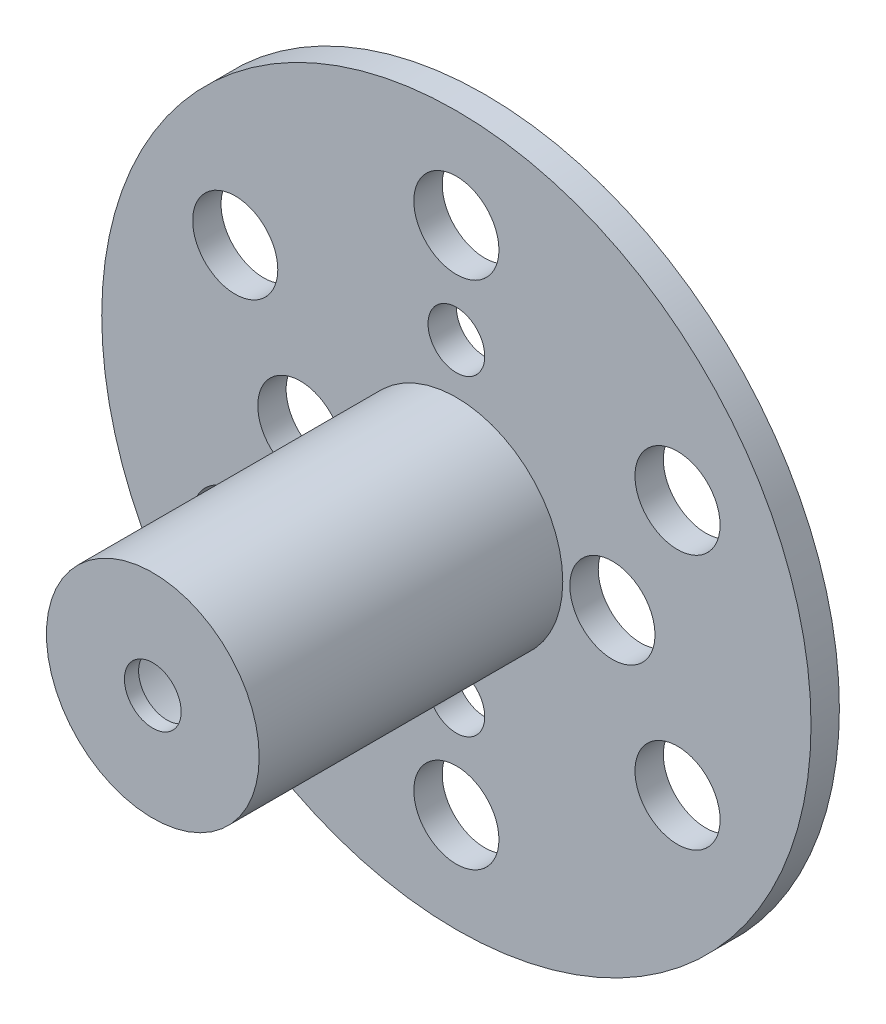
ISO-10303-21;
HEADER;
FILE_DESCRIPTION(('STEP AP214'),'2;1');
FILE_NAME('part.step','',(''),(''),'','','');
FILE_SCHEMA(('AUTOMOTIVE_DESIGN { 1 0 10303 214 1 1 1 1 }'));
ENDSEC;
DATA;
#1=APPLICATION_CONTEXT('core data for automotive mechanical design processes');
#2=APPLICATION_PROTOCOL_DEFINITION('international standard','automotive_design',2000,#1);
#3=PRODUCT_CONTEXT('',#1,'mechanical');
#4=PRODUCT('Part','Part','',(#3));
#5=PRODUCT_RELATED_PRODUCT_CATEGORY('part','',(#4));
#6=PRODUCT_DEFINITION_FORMATION('','',#4);
#7=PRODUCT_DEFINITION_CONTEXT('part definition',#1,'design');
#8=PRODUCT_DEFINITION('design','',#6,#7);
#9=PRODUCT_DEFINITION_SHAPE('','',#8);
#10=(LENGTH_UNIT() NAMED_UNIT(*) SI_UNIT(.MILLI.,.METRE.));
#11=(NAMED_UNIT(*) PLANE_ANGLE_UNIT() SI_UNIT($,.RADIAN.));
#12=(NAMED_UNIT(*) SI_UNIT($,.STERADIAN.) SOLID_ANGLE_UNIT());
#13=UNCERTAINTY_MEASURE_WITH_UNIT(LENGTH_MEASURE(1.E-05),#10,'distance_accuracy_value','');
#14=(GEOMETRIC_REPRESENTATION_CONTEXT(3) GLOBAL_UNCERTAINTY_ASSIGNED_CONTEXT((#13)) GLOBAL_UNIT_ASSIGNED_CONTEXT((#10,
#11,#12)) REPRESENTATION_CONTEXT('',''));
#15=CARTESIAN_POINT('',(0.,0.,0.));
#16=DIRECTION('',(0.,0.,1.));
#17=DIRECTION('',(1.,0.,0.));
#18=AXIS2_PLACEMENT_3D('',#15,#16,#17);
#19=CARTESIAN_POINT('',(0.,0.,1.));
#20=DIRECTION('',(0.,0.,1.));
#21=DIRECTION('',(1.,0.,0.));
#22=AXIS2_PLACEMENT_3D('',#19,#20,#21);
#23=PLANE('',#22);
#24=CARTESIAN_POINT('',(0.,-5.5,1.));
#25=DIRECTION('',(0.,0.,1.));
#26=DIRECTION('',(-1.,0.,0.));
#27=AXIS2_PLACEMENT_3D('',#24,#25,#26);
#28=CIRCLE('',#27,1.);
#29=CARTESIAN_POINT('',(-1.,-5.5,1.));
#30=VERTEX_POINT('',#29);
#31=EDGE_CURVE('E100',#30,#30,#28,.T.);
#32=ORIENTED_EDGE('',*,*,#31,.F.);
#33=EDGE_LOOP('',(#32));
#34=FACE_BOUND('',#33,.T.);
#35=CARTESIAN_POINT('',(5.5,0.,1.));
#36=DIRECTION('',(0.,0.,1.));
#37=DIRECTION('',(-1.,0.,0.));
#38=AXIS2_PLACEMENT_3D('',#35,#36,#37);
#39=CIRCLE('',#38,1.5);
#40=CARTESIAN_POINT('',(4.,0.,1.));
#41=VERTEX_POINT('',#40);
#42=EDGE_CURVE('E88',#41,#41,#39,.T.);
#43=ORIENTED_EDGE('',*,*,#42,.F.);
#44=EDGE_LOOP('',(#43));
#45=FACE_BOUND('',#44,.T.);
#46=CARTESIAN_POINT('',(-7.79422863405995,4.49999999999999,1.));
#47=DIRECTION('',(0.,0.,1.));
#48=DIRECTION('',(1.,0.,0.));
#49=AXIS2_PLACEMENT_3D('',#46,#47,#48);
#50=CIRCLE('',#49,1.5);
#51=CARTESIAN_POINT('',(-6.29422863405995,4.49999999999999,1.));
#52=VERTEX_POINT('',#51);
#53=EDGE_CURVE('E76',#52,#52,#50,.T.);
#54=ORIENTED_EDGE('',*,*,#53,.F.);
#55=EDGE_LOOP('',(#54));
#56=FACE_BOUND('',#55,.T.);
#57=CARTESIAN_POINT('',(0.,-9.,1.));
#58=DIRECTION('',(0.,0.,1.));
#59=DIRECTION('',(1.,0.,0.));
#60=AXIS2_PLACEMENT_3D('',#57,#58,#59);
#61=CIRCLE('',#60,1.5);
#62=CARTESIAN_POINT('',(1.5,-9.,1.));
#63=VERTEX_POINT('',#62);
#64=EDGE_CURVE('E64',#63,#63,#61,.T.);
#65=ORIENTED_EDGE('',*,*,#64,.F.);
#66=EDGE_LOOP('',(#65));
#67=FACE_BOUND('',#66,.T.);
#68=CARTESIAN_POINT('',(7.79422863405995,4.5,1.));
#69=DIRECTION('',(0.,0.,1.));
#70=DIRECTION('',(1.,0.,0.));
#71=AXIS2_PLACEMENT_3D('',#68,#69,#70);
#72=CIRCLE('',#71,1.5);
#73=CARTESIAN_POINT('',(9.29422863405994,4.5,1.));
#74=VERTEX_POINT('',#73);
#75=EDGE_CURVE('E52',#74,#74,#72,.T.);
#76=ORIENTED_EDGE('',*,*,#75,.F.);
#77=EDGE_LOOP('',(#76));
#78=FACE_BOUND('',#77,.T.);
#79=CARTESIAN_POINT('',(0.,0.,1.));
#80=DIRECTION('',(0.,0.,1.));
#81=DIRECTION('',(1.,0.,0.));
#82=AXIS2_PLACEMENT_3D('',#79,#80,#81);
#83=CIRCLE('',#82,12.5);
#84=CARTESIAN_POINT('',(12.5,0.,1.));
#85=VERTEX_POINT('',#84);
#86=EDGE_CURVE('E10',#85,#85,#83,.T.);
#87=ORIENTED_EDGE('',*,*,#86,.T.);
#88=EDGE_LOOP('',(#87));
#89=FACE_BOUND('',#88,.T.);
#90=CARTESIAN_POINT('',(0.,9.,1.));
#91=DIRECTION('',(0.,0.,1.));
#92=DIRECTION('',(1.,0.,0.));
#93=AXIS2_PLACEMENT_3D('',#90,#91,#92);
#94=CIRCLE('',#93,1.5);
#95=CARTESIAN_POINT('',(1.5,9.,1.));
#96=VERTEX_POINT('',#95);
#97=EDGE_CURVE('E48',#96,#96,#94,.T.);
#98=ORIENTED_EDGE('',*,*,#97,.F.);
#99=EDGE_LOOP('',(#98));
#100=FACE_BOUND('',#99,.T.);
#101=CARTESIAN_POINT('',(7.79422863405995,-4.5,1.));
#102=DIRECTION('',(0.,0.,1.));
#103=DIRECTION('',(1.,0.,0.));
#104=AXIS2_PLACEMENT_3D('',#101,#102,#103);
#105=CIRCLE('',#104,1.5);
#106=CARTESIAN_POINT('',(9.29422863405995,-4.5,1.));
#107=VERTEX_POINT('',#106);
#108=EDGE_CURVE('E58',#107,#107,#105,.T.);
#109=ORIENTED_EDGE('',*,*,#108,.F.);
#110=EDGE_LOOP('',(#109));
#111=FACE_BOUND('',#110,.T.);
#112=CARTESIAN_POINT('',(-7.79422863405995,-4.5,1.));
#113=DIRECTION('',(0.,0.,1.));
#114=DIRECTION('',(1.,0.,0.));
#115=AXIS2_PLACEMENT_3D('',#112,#113,#114);
#116=CIRCLE('',#115,1.5);
#117=CARTESIAN_POINT('',(-6.29422863405995,-4.5,1.));
#118=VERTEX_POINT('',#117);
#119=EDGE_CURVE('E70',#118,#118,#116,.T.);
#120=ORIENTED_EDGE('',*,*,#119,.F.);
#121=EDGE_LOOP('',(#120));
#122=FACE_BOUND('',#121,.T.);
#123=CARTESIAN_POINT('',(-5.5,0.,1.));
#124=DIRECTION('',(0.,0.,1.));
#125=DIRECTION('',(1.,0.,0.));
#126=AXIS2_PLACEMENT_3D('',#123,#124,#125);
#127=CIRCLE('',#126,1.5);
#128=CARTESIAN_POINT('',(-4.,0.,1.));
#129=VERTEX_POINT('',#128);
#130=EDGE_CURVE('E82',#129,#129,#127,.T.);
#131=ORIENTED_EDGE('',*,*,#130,.F.);
#132=EDGE_LOOP('',(#131));
#133=FACE_BOUND('',#132,.T.);
#134=CARTESIAN_POINT('',(0.,5.5,1.));
#135=DIRECTION('',(0.,0.,1.));
#136=DIRECTION('',(1.,0.,0.));
#137=AXIS2_PLACEMENT_3D('',#134,#135,#136);
#138=CIRCLE('',#137,1.);
#139=CARTESIAN_POINT('',(1.,5.5,1.));
#140=VERTEX_POINT('',#139);
#141=EDGE_CURVE('E94',#140,#140,#138,.T.);
#142=ORIENTED_EDGE('',*,*,#141,.F.);
#143=EDGE_LOOP('',(#142));
#144=FACE_BOUND('',#143,.T.);
#145=CARTESIAN_POINT('',(0.,0.,1.));
#146=DIRECTION('',(0.,0.,1.));
#147=DIRECTION('',(1.,0.,0.));
#148=AXIS2_PLACEMENT_3D('',#145,#146,#147);
#149=CIRCLE('',#148,3.75);
#150=CARTESIAN_POINT('',(3.75,0.,1.));
#151=VERTEX_POINT('',#150);
#152=EDGE_CURVE('E106',#151,#151,#149,.T.);
#153=ORIENTED_EDGE('',*,*,#152,.F.);
#154=EDGE_LOOP('',(#153));
#155=FACE_BOUND('',#154,.T.);
#156=ADVANCED_FACE('F33',(#34,#45,#56,#67,#78,#89,#100,#111,#122,#133,#144,#155),#23,.T.);
#157=CARTESIAN_POINT('',(0.,0.,0.));
#158=DIRECTION('',(0.,0.,1.));
#159=DIRECTION('',(1.,0.,0.));
#160=AXIS2_PLACEMENT_3D('',#157,#158,#159);
#161=PLANE('',#160);
#162=CARTESIAN_POINT('',(0.,0.,0.));
#163=DIRECTION('',(0.,0.,1.));
#164=DIRECTION('',(1.,0.,0.));
#165=AXIS2_PLACEMENT_3D('',#162,#163,#164);
#166=CIRCLE('',#165,12.5);
#167=CARTESIAN_POINT('',(12.5,0.,0.));
#168=VERTEX_POINT('',#167);
#169=EDGE_CURVE('E37',#168,#168,#166,.T.);
#170=ORIENTED_EDGE('',*,*,#169,.F.);
#171=EDGE_LOOP('',(#170));
#172=FACE_BOUND('',#171,.T.);
#173=CARTESIAN_POINT('',(0.,0.,0.));
#174=DIRECTION('',(0.,0.,1.));
#175=DIRECTION('',(1.,0.,0.));
#176=AXIS2_PLACEMENT_3D('',#173,#174,#175);
#177=CIRCLE('',#176,2.75);
#178=CARTESIAN_POINT('',(2.75,0.,0.));
#179=VERTEX_POINT('',#178);
#180=EDGE_CURVE('E44',#179,#179,#177,.T.);
#181=ORIENTED_EDGE('',*,*,#180,.T.);
#182=EDGE_LOOP('',(#181));
#183=FACE_BOUND('',#182,.T.);
#184=CARTESIAN_POINT('',(0.,9.,0.));
#185=DIRECTION('',(0.,0.,1.));
#186=DIRECTION('',(1.,0.,0.));
#187=AXIS2_PLACEMENT_3D('',#184,#185,#186);
#188=CIRCLE('',#187,1.5);
#189=CARTESIAN_POINT('',(1.5,9.,0.));
#190=VERTEX_POINT('',#189);
#191=EDGE_CURVE('E49',#190,#190,#188,.T.);
#192=ORIENTED_EDGE('',*,*,#191,.T.);
#193=EDGE_LOOP('',(#192));
#194=FACE_BOUND('',#193,.T.);
#195=CARTESIAN_POINT('',(7.79422863405995,4.5,0.));
#196=DIRECTION('',(0.,0.,1.));
#197=DIRECTION('',(1.,0.,0.));
#198=AXIS2_PLACEMENT_3D('',#195,#196,#197);
#199=CIRCLE('',#198,1.5);
#200=CARTESIAN_POINT('',(9.29422863405994,4.5,0.));
#201=VERTEX_POINT('',#200);
#202=EDGE_CURVE('E55',#201,#201,#199,.T.);
#203=ORIENTED_EDGE('',*,*,#202,.T.);
#204=EDGE_LOOP('',(#203));
#205=FACE_BOUND('',#204,.T.);
#206=CARTESIAN_POINT('',(7.79422863405995,-4.5,0.));
#207=DIRECTION('',(0.,0.,1.));
#208=DIRECTION('',(1.,0.,0.));
#209=AXIS2_PLACEMENT_3D('',#206,#207,#208);
#210=CIRCLE('',#209,1.5);
#211=CARTESIAN_POINT('',(9.29422863405995,-4.5,0.));
#212=VERTEX_POINT('',#211);
#213=EDGE_CURVE('E61',#212,#212,#210,.T.);
#214=ORIENTED_EDGE('',*,*,#213,.T.);
#215=EDGE_LOOP('',(#214));
#216=FACE_BOUND('',#215,.T.);
#217=CARTESIAN_POINT('',(0.,-9.,0.));
#218=DIRECTION('',(0.,0.,1.));
#219=DIRECTION('',(1.,0.,0.));
#220=AXIS2_PLACEMENT_3D('',#217,#218,#219);
#221=CIRCLE('',#220,1.5);
#222=CARTESIAN_POINT('',(1.5,-9.,0.));
#223=VERTEX_POINT('',#222);
#224=EDGE_CURVE('E67',#223,#223,#221,.T.);
#225=ORIENTED_EDGE('',*,*,#224,.T.);
#226=EDGE_LOOP('',(#225));
#227=FACE_BOUND('',#226,.T.);
#228=CARTESIAN_POINT('',(-7.79422863405995,-4.5,0.));
#229=DIRECTION('',(0.,0.,1.));
#230=DIRECTION('',(1.,0.,0.));
#231=AXIS2_PLACEMENT_3D('',#228,#229,#230);
#232=CIRCLE('',#231,1.5);
#233=CARTESIAN_POINT('',(-6.29422863405995,-4.5,0.));
#234=VERTEX_POINT('',#233);
#235=EDGE_CURVE('E73',#234,#234,#232,.T.);
#236=ORIENTED_EDGE('',*,*,#235,.T.);
#237=EDGE_LOOP('',(#236));
#238=FACE_BOUND('',#237,.T.);
#239=CARTESIAN_POINT('',(-7.79422863405995,4.49999999999999,0.));
#240=DIRECTION('',(0.,0.,1.));
#241=DIRECTION('',(1.,0.,0.));
#242=AXIS2_PLACEMENT_3D('',#239,#240,#241);
#243=CIRCLE('',#242,1.5);
#244=CARTESIAN_POINT('',(-6.29422863405995,4.49999999999999,0.));
#245=VERTEX_POINT('',#244);
#246=EDGE_CURVE('E79',#245,#245,#243,.T.);
#247=ORIENTED_EDGE('',*,*,#246,.T.);
#248=EDGE_LOOP('',(#247));
#249=FACE_BOUND('',#248,.T.);
#250=CARTESIAN_POINT('',(-5.5,0.,0.));
#251=DIRECTION('',(0.,0.,1.));
#252=DIRECTION('',(1.,0.,0.));
#253=AXIS2_PLACEMENT_3D('',#250,#251,#252);
#254=CIRCLE('',#253,1.5);
#255=CARTESIAN_POINT('',(-4.,0.,0.));
#256=VERTEX_POINT('',#255);
#257=EDGE_CURVE('E85',#256,#256,#254,.T.);
#258=ORIENTED_EDGE('',*,*,#257,.T.);
#259=EDGE_LOOP('',(#258));
#260=FACE_BOUND('',#259,.T.);
#261=CARTESIAN_POINT('',(5.5,0.,0.));
#262=DIRECTION('',(0.,0.,1.));
#263=DIRECTION('',(-1.,0.,0.));
#264=AXIS2_PLACEMENT_3D('',#261,#262,#263);
#265=CIRCLE('',#264,1.5);
#266=CARTESIAN_POINT('',(4.,0.,0.));
#267=VERTEX_POINT('',#266);
#268=EDGE_CURVE('E91',#267,#267,#265,.T.);
#269=ORIENTED_EDGE('',*,*,#268,.T.);
#270=EDGE_LOOP('',(#269));
#271=FACE_BOUND('',#270,.T.);
#272=CARTESIAN_POINT('',(0.,5.5,0.));
#273=DIRECTION('',(0.,0.,1.));
#274=DIRECTION('',(1.,0.,0.));
#275=AXIS2_PLACEMENT_3D('',#272,#273,#274);
#276=CIRCLE('',#275,1.);
#277=CARTESIAN_POINT('',(1.,5.5,0.));
#278=VERTEX_POINT('',#277);
#279=EDGE_CURVE('E97',#278,#278,#276,.T.);
#280=ORIENTED_EDGE('',*,*,#279,.T.);
#281=EDGE_LOOP('',(#280));
#282=FACE_BOUND('',#281,.T.);
#283=CARTESIAN_POINT('',(0.,-5.5,0.));
#284=DIRECTION('',(0.,0.,1.));
#285=DIRECTION('',(-1.,0.,0.));
#286=AXIS2_PLACEMENT_3D('',#283,#284,#285);
#287=CIRCLE('',#286,1.);
#288=CARTESIAN_POINT('',(-1.,-5.5,0.));
#289=VERTEX_POINT('',#288);
#290=EDGE_CURVE('E103',#289,#289,#287,.T.);
#291=ORIENTED_EDGE('',*,*,#290,.T.);
#292=EDGE_LOOP('',(#291));
#293=FACE_BOUND('',#292,.T.);
#294=ADVANCED_FACE('F141',(#172,#183,#194,#205,#216,#227,#238,#249,#260,#271,#282,#293),#161,.F.);
#295=CARTESIAN_POINT('',(0.,0.,1.));
#296=DIRECTION('',(0.,0.,-1.));
#297=DIRECTION('',(-1.,0.,0.));
#298=AXIS2_PLACEMENT_3D('',#295,#296,#297);
#299=CYLINDRICAL_SURFACE('',#298,12.5);
#300=ORIENTED_EDGE('',*,*,#86,.F.);
#301=EDGE_LOOP('',(#300));
#302=FACE_BOUND('',#301,.T.);
#303=ORIENTED_EDGE('',*,*,#169,.T.);
#304=EDGE_LOOP('',(#303));
#305=FACE_BOUND('',#304,.T.);
#306=ADVANCED_FACE('F35',(#302,#305),#299,.T.);
#307=CARTESIAN_POINT('',(0.,0.,1.));
#308=DIRECTION('',(0.,0.,-1.));
#309=DIRECTION('',(-1.,0.,0.));
#310=AXIS2_PLACEMENT_3D('',#307,#308,#309);
#311=CYLINDRICAL_SURFACE('',#310,2.75);
#312=ORIENTED_EDGE('',*,*,#180,.F.);
#313=EDGE_LOOP('',(#312));
#314=FACE_BOUND('',#313,.T.);
#315=CARTESIAN_POINT('',(0.,0.,11.2));
#316=DIRECTION('',(0.,0.,1.));
#317=DIRECTION('',(1.,0.,0.));
#318=AXIS2_PLACEMENT_3D('',#315,#316,#317);
#319=CIRCLE('',#318,2.75);
#320=CARTESIAN_POINT('',(2.75,0.,11.2));
#321=VERTEX_POINT('',#320);
#322=EDGE_CURVE('E111',#321,#321,#319,.T.);
#323=ORIENTED_EDGE('',*,*,#322,.T.);
#324=EDGE_LOOP('',(#323));
#325=FACE_BOUND('',#324,.T.);
#326=ADVANCED_FACE('F151',(#314,#325),#311,.F.);
#327=CARTESIAN_POINT('',(0.,9.,1.));
#328=DIRECTION('',(0.,0.,-1.));
#329=DIRECTION('',(-1.,0.,0.));
#330=AXIS2_PLACEMENT_3D('',#327,#328,#329);
#331=CYLINDRICAL_SURFACE('',#330,1.5);
#332=ORIENTED_EDGE('',*,*,#97,.T.);
#333=EDGE_LOOP('',(#332));
#334=FACE_BOUND('',#333,.T.);
#335=ORIENTED_EDGE('',*,*,#191,.F.);
#336=EDGE_LOOP('',(#335));
#337=FACE_BOUND('',#336,.T.);
#338=ADVANCED_FACE('F154',(#334,#337),#331,.F.);
#339=CARTESIAN_POINT('',(7.79422863405995,4.5,1.));
#340=DIRECTION('',(0.,0.,-1.));
#341=DIRECTION('',(-1.,0.,0.));
#342=AXIS2_PLACEMENT_3D('',#339,#340,#341);
#343=CYLINDRICAL_SURFACE('',#342,1.5);
#344=ORIENTED_EDGE('',*,*,#75,.T.);
#345=EDGE_LOOP('',(#344));
#346=FACE_BOUND('',#345,.T.);
#347=ORIENTED_EDGE('',*,*,#202,.F.);
#348=EDGE_LOOP('',(#347));
#349=FACE_BOUND('',#348,.T.);
#350=ADVANCED_FACE('F158',(#346,#349),#343,.F.);
#351=CARTESIAN_POINT('',(7.79422863405995,-4.5,1.));
#352=DIRECTION('',(0.,0.,-1.));
#353=DIRECTION('',(-1.,0.,0.));
#354=AXIS2_PLACEMENT_3D('',#351,#352,#353);
#355=CYLINDRICAL_SURFACE('',#354,1.5);
#356=ORIENTED_EDGE('',*,*,#108,.T.);
#357=EDGE_LOOP('',(#356));
#358=FACE_BOUND('',#357,.T.);
#359=ORIENTED_EDGE('',*,*,#213,.F.);
#360=EDGE_LOOP('',(#359));
#361=FACE_BOUND('',#360,.T.);
#362=ADVANCED_FACE('F162',(#358,#361),#355,.F.);
#363=CARTESIAN_POINT('',(0.,-9.,1.));
#364=DIRECTION('',(0.,0.,-1.));
#365=DIRECTION('',(-1.,0.,0.));
#366=AXIS2_PLACEMENT_3D('',#363,#364,#365);
#367=CYLINDRICAL_SURFACE('',#366,1.5);
#368=ORIENTED_EDGE('',*,*,#64,.T.);
#369=EDGE_LOOP('',(#368));
#370=FACE_BOUND('',#369,.T.);
#371=ORIENTED_EDGE('',*,*,#224,.F.);
#372=EDGE_LOOP('',(#371));
#373=FACE_BOUND('',#372,.T.);
#374=ADVANCED_FACE('F166',(#370,#373),#367,.F.);
#375=CARTESIAN_POINT('',(-7.79422863405995,-4.5,1.));
#376=DIRECTION('',(0.,0.,-1.));
#377=DIRECTION('',(-1.,0.,0.));
#378=AXIS2_PLACEMENT_3D('',#375,#376,#377);
#379=CYLINDRICAL_SURFACE('',#378,1.5);
#380=ORIENTED_EDGE('',*,*,#119,.T.);
#381=EDGE_LOOP('',(#380));
#382=FACE_BOUND('',#381,.T.);
#383=ORIENTED_EDGE('',*,*,#235,.F.);
#384=EDGE_LOOP('',(#383));
#385=FACE_BOUND('',#384,.T.);
#386=ADVANCED_FACE('F170',(#382,#385),#379,.F.);
#387=CARTESIAN_POINT('',(-7.79422863405995,4.49999999999999,1.));
#388=DIRECTION('',(0.,0.,-1.));
#389=DIRECTION('',(-1.,0.,0.));
#390=AXIS2_PLACEMENT_3D('',#387,#388,#389);
#391=CYLINDRICAL_SURFACE('',#390,1.5);
#392=ORIENTED_EDGE('',*,*,#53,.T.);
#393=EDGE_LOOP('',(#392));
#394=FACE_BOUND('',#393,.T.);
#395=ORIENTED_EDGE('',*,*,#246,.F.);
#396=EDGE_LOOP('',(#395));
#397=FACE_BOUND('',#396,.T.);
#398=ADVANCED_FACE('F174',(#394,#397),#391,.F.);
#399=CARTESIAN_POINT('',(-5.5,0.,1.));
#400=DIRECTION('',(0.,0.,-1.));
#401=DIRECTION('',(-1.,0.,0.));
#402=AXIS2_PLACEMENT_3D('',#399,#400,#401);
#403=CYLINDRICAL_SURFACE('',#402,1.5);
#404=ORIENTED_EDGE('',*,*,#130,.T.);
#405=EDGE_LOOP('',(#404));
#406=FACE_BOUND('',#405,.T.);
#407=ORIENTED_EDGE('',*,*,#257,.F.);
#408=EDGE_LOOP('',(#407));
#409=FACE_BOUND('',#408,.T.);
#410=ADVANCED_FACE('F178',(#406,#409),#403,.F.);
#411=CARTESIAN_POINT('',(5.5,0.,1.));
#412=DIRECTION('',(0.,0.,-1.));
#413=DIRECTION('',(-1.,0.,0.));
#414=AXIS2_PLACEMENT_3D('',#411,#412,#413);
#415=CYLINDRICAL_SURFACE('',#414,1.5);
#416=ORIENTED_EDGE('',*,*,#42,.T.);
#417=EDGE_LOOP('',(#416));
#418=FACE_BOUND('',#417,.T.);
#419=ORIENTED_EDGE('',*,*,#268,.F.);
#420=EDGE_LOOP('',(#419));
#421=FACE_BOUND('',#420,.T.);
#422=ADVANCED_FACE('F182',(#418,#421),#415,.F.);
#423=CARTESIAN_POINT('',(0.,5.5,1.));
#424=DIRECTION('',(0.,0.,-1.));
#425=DIRECTION('',(-1.,0.,0.));
#426=AXIS2_PLACEMENT_3D('',#423,#424,#425);
#427=CYLINDRICAL_SURFACE('',#426,1.);
#428=ORIENTED_EDGE('',*,*,#141,.T.);
#429=EDGE_LOOP('',(#428));
#430=FACE_BOUND('',#429,.T.);
#431=ORIENTED_EDGE('',*,*,#279,.F.);
#432=EDGE_LOOP('',(#431));
#433=FACE_BOUND('',#432,.T.);
#434=ADVANCED_FACE('F186',(#430,#433),#427,.F.);
#435=CARTESIAN_POINT('',(0.,-5.5,1.));
#436=DIRECTION('',(0.,0.,-1.));
#437=DIRECTION('',(-1.,0.,0.));
#438=AXIS2_PLACEMENT_3D('',#435,#436,#437);
#439=CYLINDRICAL_SURFACE('',#438,1.);
#440=ORIENTED_EDGE('',*,*,#31,.T.);
#441=EDGE_LOOP('',(#440));
#442=FACE_BOUND('',#441,.T.);
#443=ORIENTED_EDGE('',*,*,#290,.F.);
#444=EDGE_LOOP('',(#443));
#445=FACE_BOUND('',#444,.T.);
#446=ADVANCED_FACE('F190',(#442,#445),#439,.F.);
#447=CARTESIAN_POINT('',(0.,0.,11.2));
#448=DIRECTION('',(0.,0.,-1.));
#449=DIRECTION('',(-1.,0.,0.));
#450=AXIS2_PLACEMENT_3D('',#447,#448,#449);
#451=CYLINDRICAL_SURFACE('',#450,3.75);
#452=ORIENTED_EDGE('',*,*,#152,.T.);
#453=EDGE_LOOP('',(#452));
#454=FACE_BOUND('',#453,.T.);
#455=CARTESIAN_POINT('',(0.,0.,11.7));
#456=DIRECTION('',(0.,0.,1.));
#457=DIRECTION('',(1.,0.,0.));
#458=AXIS2_PLACEMENT_3D('',#455,#456,#457);
#459=CIRCLE('',#458,3.75);
#460=CARTESIAN_POINT('',(3.75,0.,11.7));
#461=VERTEX_POINT('',#460);
#462=EDGE_CURVE('E114',#461,#461,#459,.T.);
#463=ORIENTED_EDGE('',*,*,#462,.F.);
#464=EDGE_LOOP('',(#463));
#465=FACE_BOUND('',#464,.T.);
#466=ADVANCED_FACE('F137',(#454,#465),#451,.T.);
#467=CARTESIAN_POINT('',(0.,0.,11.2));
#468=DIRECTION('',(0.,0.,1.));
#469=DIRECTION('',(1.,0.,0.));
#470=AXIS2_PLACEMENT_3D('',#467,#468,#469);
#471=PLANE('',#470);
#472=CARTESIAN_POINT('',(0.,0.,11.2));
#473=DIRECTION('',(0.,0.,1.));
#474=DIRECTION('',(1.,0.,0.));
#475=AXIS2_PLACEMENT_3D('',#472,#473,#474);
#476=CIRCLE('',#475,1.);
#477=CARTESIAN_POINT('',(1.,0.,11.2));
#478=VERTEX_POINT('',#477);
#479=EDGE_CURVE('E118',#478,#478,#476,.T.);
#480=ORIENTED_EDGE('',*,*,#479,.T.);
#481=EDGE_LOOP('',(#480));
#482=FACE_BOUND('',#481,.T.);
#483=ORIENTED_EDGE('',*,*,#322,.F.);
#484=EDGE_LOOP('',(#483));
#485=FACE_BOUND('',#484,.T.);
#486=ADVANCED_FACE('F129',(#482,#485),#471,.F.);
#487=CARTESIAN_POINT('',(0.,0.,11.7));
#488=DIRECTION('',(0.,0.,1.));
#489=DIRECTION('',(1.,0.,0.));
#490=AXIS2_PLACEMENT_3D('',#487,#488,#489);
#491=PLANE('',#490);
#492=ORIENTED_EDGE('',*,*,#462,.T.);
#493=EDGE_LOOP('',(#492));
#494=FACE_BOUND('',#493,.T.);
#495=CARTESIAN_POINT('',(0.,0.,11.7));
#496=DIRECTION('',(0.,0.,1.));
#497=DIRECTION('',(1.,0.,0.));
#498=AXIS2_PLACEMENT_3D('',#495,#496,#497);
#499=CIRCLE('',#498,1.);
#500=CARTESIAN_POINT('',(1.,0.,11.7));
#501=VERTEX_POINT('',#500);
#502=EDGE_CURVE('E117',#501,#501,#499,.T.);
#503=ORIENTED_EDGE('',*,*,#502,.F.);
#504=EDGE_LOOP('',(#503));
#505=FACE_BOUND('',#504,.T.);
#506=ADVANCED_FACE('F127',(#494,#505),#491,.T.);
#507=CARTESIAN_POINT('',(0.,0.,11.7));
#508=DIRECTION('',(0.,0.,-1.));
#509=DIRECTION('',(-1.,0.,0.));
#510=AXIS2_PLACEMENT_3D('',#507,#508,#509);
#511=CYLINDRICAL_SURFACE('',#510,1.);
#512=ORIENTED_EDGE('',*,*,#502,.T.);
#513=EDGE_LOOP('',(#512));
#514=FACE_BOUND('',#513,.T.);
#515=ORIENTED_EDGE('',*,*,#479,.F.);
#516=EDGE_LOOP('',(#515));
#517=FACE_BOUND('',#516,.T.);
#518=ADVANCED_FACE('F124',(#514,#517),#511,.F.);
#519=CLOSED_SHELL('',(#156,#294,#306,#326,#338,#350,#362,#374,#386,#398,#410,#422,#434,#446,
#466,#486,#506,#518));
#520=MANIFOLD_SOLID_BREP('B2',#519);
#521=ADVANCED_BREP_SHAPE_REPRESENTATION('',(#18,#520),#14);
#522=SHAPE_DEFINITION_REPRESENTATION(#9,#521);
ENDSEC;
END-ISO-10303-21;
